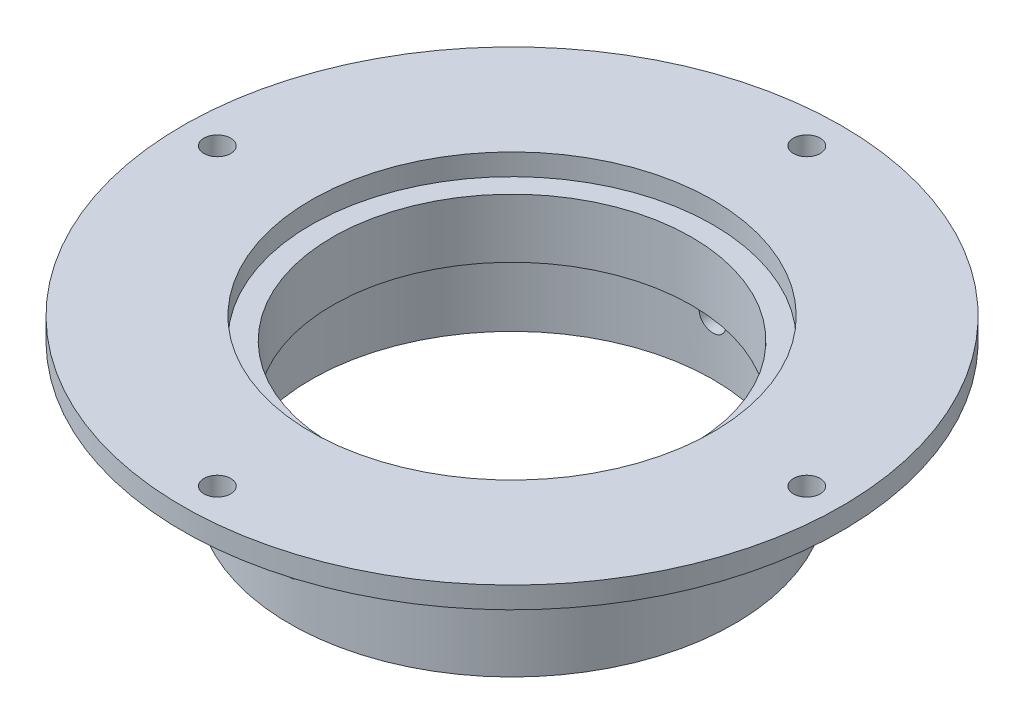
ISO-10303-21;
HEADER;
FILE_DESCRIPTION(('STEP AP214'),'2;1');
FILE_NAME('part.step','',(''),(''),'','','');
FILE_SCHEMA(('AUTOMOTIVE_DESIGN { 1 0 10303 214 1 1 1 1 }'));
ENDSEC;
DATA;
#1=APPLICATION_CONTEXT('core data for automotive mechanical design processes');
#2=APPLICATION_PROTOCOL_DEFINITION('international standard','automotive_design',2000,#1);
#3=PRODUCT_CONTEXT('',#1,'mechanical');
#4=PRODUCT('Part','Part','',(#3));
#5=PRODUCT_RELATED_PRODUCT_CATEGORY('part','',(#4));
#6=PRODUCT_DEFINITION_FORMATION('','',#4);
#7=PRODUCT_DEFINITION_CONTEXT('part definition',#1,'design');
#8=PRODUCT_DEFINITION('design','',#6,#7);
#9=PRODUCT_DEFINITION_SHAPE('','',#8);
#10=(LENGTH_UNIT() NAMED_UNIT(*) SI_UNIT(.MILLI.,.METRE.));
#11=(NAMED_UNIT(*) PLANE_ANGLE_UNIT() SI_UNIT($,.RADIAN.));
#12=(NAMED_UNIT(*) SI_UNIT($,.STERADIAN.) SOLID_ANGLE_UNIT());
#13=UNCERTAINTY_MEASURE_WITH_UNIT(LENGTH_MEASURE(1.E-05),#10,'distance_accuracy_value','');
#14=(GEOMETRIC_REPRESENTATION_CONTEXT(3) GLOBAL_UNCERTAINTY_ASSIGNED_CONTEXT((#13)) GLOBAL_UNIT_ASSIGNED_CONTEXT((#10,
#11,#12)) REPRESENTATION_CONTEXT('',''));
#15=CARTESIAN_POINT('',(0.,0.,0.));
#16=DIRECTION('',(0.,0.,1.));
#17=DIRECTION('',(1.,0.,0.));
#18=AXIS2_PLACEMENT_3D('',#15,#16,#17);
#19=CARTESIAN_POINT('',(0.,-100.5,0.));
#20=DIRECTION('',(0.,-1.,0.));
#21=DIRECTION('',(0.,0.,-1.));
#22=AXIS2_PLACEMENT_3D('',#19,#20,#21);
#23=CYLINDRICAL_SURFACE('',#22,37.5);
#24=CARTESIAN_POINT('',(0.,0.,0.));
#25=DIRECTION('',(0.,-1.,0.));
#26=DIRECTION('',(0.,0.,-1.));
#27=AXIS2_PLACEMENT_3D('',#24,#25,#26);
#28=CIRCLE('',#27,37.5);
#29=CARTESIAN_POINT('',(0.,0.,-37.5));
#30=VERTEX_POINT('',#29);
#31=EDGE_CURVE('E150',#30,#30,#28,.T.);
#32=ORIENTED_EDGE('',*,*,#31,.F.);
#33=EDGE_LOOP('',(#32));
#34=FACE_BOUND('',#33,.T.);
#35=CARTESIAN_POINT('',(0.,-4.,0.));
#36=DIRECTION('',(0.,-1.,0.));
#37=DIRECTION('',(0.,0.,-1.));
#38=AXIS2_PLACEMENT_3D('',#35,#36,#37);
#39=CIRCLE('',#38,37.5);
#40=CARTESIAN_POINT('',(0.,-4.,-37.5));
#41=VERTEX_POINT('',#40);
#42=EDGE_CURVE('E10',#41,#41,#39,.T.);
#43=ORIENTED_EDGE('',*,*,#42,.T.);
#44=EDGE_LOOP('',(#43));
#45=FACE_BOUND('',#44,.T.);
#46=ADVANCED_FACE('F41',(#34,#45),#23,.F.);
#47=CARTESIAN_POINT('',(-33.5,-4.,0.));
#48=DIRECTION('',(0.,-1.,0.));
#49=DIRECTION('',(0.,0.,-1.));
#50=AXIS2_PLACEMENT_3D('',#47,#48,#49);
#51=PLANE('',#50);
#52=ORIENTED_EDGE('',*,*,#42,.F.);
#53=EDGE_LOOP('',(#52));
#54=FACE_BOUND('',#53,.T.);
#55=CARTESIAN_POINT('',(0.,-4.,0.));
#56=DIRECTION('',(0.,-1.,0.));
#57=DIRECTION('',(0.,0.,-1.));
#58=AXIS2_PLACEMENT_3D('',#55,#56,#57);
#59=CIRCLE('',#58,33.5);
#60=CARTESIAN_POINT('',(0.,-4.,-33.5));
#61=VERTEX_POINT('',#60);
#62=EDGE_CURVE('E54',#61,#61,#59,.T.);
#63=ORIENTED_EDGE('',*,*,#62,.T.);
#64=EDGE_LOOP('',(#63));
#65=FACE_BOUND('',#64,.T.);
#66=ADVANCED_FACE('F111',(#54,#65),#51,.F.);
#67=CARTESIAN_POINT('',(0.,-100.5,0.));
#68=DIRECTION('',(0.,-1.,0.));
#69=DIRECTION('',(0.,0.,-1.));
#70=AXIS2_PLACEMENT_3D('',#67,#68,#69);
#71=CYLINDRICAL_SURFACE('',#70,33.5);
#72=ORIENTED_EDGE('',*,*,#62,.F.);
#73=EDGE_LOOP('',(#72));
#74=FACE_BOUND('',#73,.T.);
#75=CARTESIAN_POINT('',(0.,-15.,0.));
#76=DIRECTION('',(0.,-1.,0.));
#77=DIRECTION('',(0.,0.,-1.));
#78=AXIS2_PLACEMENT_3D('',#75,#76,#77);
#79=CIRCLE('',#78,33.5);
#80=CARTESIAN_POINT('',(0.,-15.,-33.5));
#81=VERTEX_POINT('',#80);
#82=EDGE_CURVE('E60',#81,#81,#79,.T.);
#83=ORIENTED_EDGE('',*,*,#82,.T.);
#84=EDGE_LOOP('',(#83));
#85=FACE_BOUND('',#84,.T.);
#86=ADVANCED_FACE('F108',(#74,#85),#71,.F.);
#87=CARTESIAN_POINT('',(-33.5,-15.,0.));
#88=DIRECTION('',(0.,1.,0.));
#89=DIRECTION('',(0.,0.,1.));
#90=AXIS2_PLACEMENT_3D('',#87,#88,#89);
#91=PLANE('',#90);
#92=ORIENTED_EDGE('',*,*,#82,.F.);
#93=EDGE_LOOP('',(#92));
#94=FACE_BOUND('',#93,.T.);
#95=CARTESIAN_POINT('',(0.,-15.,0.));
#96=DIRECTION('',(0.,-1.,0.));
#97=DIRECTION('',(0.,0.,-1.));
#98=AXIS2_PLACEMENT_3D('',#95,#96,#97);
#99=CIRCLE('',#98,37.5);
#100=CARTESIAN_POINT('',(0.,-15.,-37.5));
#101=VERTEX_POINT('',#100);
#102=EDGE_CURVE('E125',#101,#101,#99,.T.);
#103=ORIENTED_EDGE('',*,*,#102,.T.);
#104=EDGE_LOOP('',(#103));
#105=FACE_BOUND('',#104,.T.);
#106=ADVANCED_FACE('F103',(#94,#105),#91,.F.);
#107=CARTESIAN_POINT('',(0.,-100.5,0.));
#108=DIRECTION('',(0.,-1.,0.));
#109=DIRECTION('',(0.,0.,-1.));
#110=AXIS2_PLACEMENT_3D('',#107,#108,#109);
#111=CYLINDRICAL_SURFACE('',#110,37.5);
#112=CARTESIAN_POINT('',(0.,-16.5,-37.5));
#113=CARTESIAN_POINT('',(0.140258977010313,-16.5000061638706,-37.4999988949615));
#114=CARTESIAN_POINT('',(0.280615680119362,-16.5118432190733,-37.4992046860129));
#115=CARTESIAN_POINT('',(0.55745213365232,-16.5588928993364,-37.496112784275));
#116=CARTESIAN_POINT('',(0.693927201705201,-16.5941326032507,-37.493813349856));
#117=CARTESIAN_POINT('',(0.958950418399242,-16.6869696878027,-37.487971075263));
#118=CARTESIAN_POINT('',(1.08750276008044,-16.7445551223229,-37.4844288995603));
#119=CARTESIAN_POINT('',(1.33308366320748,-16.880429292928,-37.4764993321387));
#120=CARTESIAN_POINT('',(1.45011482462133,-16.9587133432211,-37.4721121317789));
#121=CARTESIAN_POINT('',(1.66956149864711,-17.1339065014567,-37.4629772438181));
#122=CARTESIAN_POINT('',(1.77195501669647,-17.2308431346089,-37.4582290298195));
#123=CARTESIAN_POINT('',(1.9590315859438,-17.4405326794866,-37.4489117445818));
#124=CARTESIAN_POINT('',(2.04371389056526,-17.5532862576056,-37.4443426809009));
#125=CARTESIAN_POINT('',(2.19303365081675,-17.7915357283236,-37.4358948341803));
#126=CARTESIAN_POINT('',(2.25765257331595,-17.9170432609483,-37.4320166907645));
#127=CARTESIAN_POINT('',(2.364892743479,-18.177156436242,-37.4253949317149));
#128=CARTESIAN_POINT('',(2.4075142544868,-18.3117619699715,-37.4226513024991));
#129=CARTESIAN_POINT('',(2.46948799848222,-18.5860361115245,-37.4186130440881));
#130=CARTESIAN_POINT('',(2.4888750410689,-18.7256968215009,-37.4173162474677));
#131=CARTESIAN_POINT('',(2.50393699377009,-19.0062957443154,-37.4163114076107));
#132=CARTESIAN_POINT('',(2.49961220364397,-19.1472339409813,-37.4166033442898));
#133=CARTESIAN_POINT('',(2.46740211693187,-19.4261496900382,-37.4187410376214));
#134=CARTESIAN_POINT('',(2.43955451686147,-19.5641316174483,-37.4205843081641));
#135=CARTESIAN_POINT('',(2.36114778897838,-19.8334582260712,-37.4256130394562));
#136=CARTESIAN_POINT('',(2.31058850980523,-19.9648028630437,-37.4287985091506));
#137=CARTESIAN_POINT('',(2.18815092527691,-20.217247436151,-37.4361555312242));
#138=CARTESIAN_POINT('',(2.11625555293596,-20.3383390707436,-37.4403278724689));
#139=CARTESIAN_POINT('',(1.95319898230805,-20.5667495312781,-37.4491876808018));
#140=CARTESIAN_POINT('',(1.86203753661863,-20.6740681803277,-37.4538751545047));
#141=CARTESIAN_POINT('',(1.66282440208197,-20.8721055868189,-37.4632480434526));
#142=CARTESIAN_POINT('',(1.55474009549578,-20.9627915371549,-37.4679334368246));
#143=CARTESIAN_POINT('',(1.32486360414213,-21.1247361426329,-37.4767653919949));
#144=CARTESIAN_POINT('',(1.20307141394195,-21.1959947900754,-37.4809119535796));
#145=CARTESIAN_POINT('',(0.949216236834571,-21.3170593718357,-37.4881994048067));
#146=CARTESIAN_POINT('',(0.817152637726992,-21.366864026286,-37.4913402344478));
#147=CARTESIAN_POINT('',(0.546512490200751,-21.443584748921,-37.4962615235866));
#148=CARTESIAN_POINT('',(0.407936028329261,-21.4705011211695,-37.4980420011561));
#149=CARTESIAN_POINT('',(0.128488427811503,-21.5006404856415,-37.5000396335898));
#150=CARTESIAN_POINT('',(-0.0123777991171103,-21.5039088289518,-37.5002597807663));
#151=CARTESIAN_POINT('',(-0.292656429188999,-21.4867779093202,-37.4991199107994));
#152=CARTESIAN_POINT('',(-0.432068840951225,-21.4663787867714,-37.4977599030293));
#153=CARTESIAN_POINT('',(-0.705354401323427,-21.402529549113,-37.4936147234098));
#154=CARTESIAN_POINT('',(-0.839232441272394,-21.359100279056,-37.4908308404194));
#155=CARTESIAN_POINT('',(-1.09780002003548,-21.2504447357855,-37.4841510218562));
#156=CARTESIAN_POINT('',(-1.22248946493214,-21.1852182398184,-37.4802550749189));
#157=CARTESIAN_POINT('',(-1.45934782845821,-21.0347046003478,-37.4717812471731));
#158=CARTESIAN_POINT('',(-1.57149749003375,-20.9493872111829,-37.4672023420591));
#159=CARTESIAN_POINT('',(-1.77989881911622,-20.7611575977401,-37.4578811933762));
#160=CARTESIAN_POINT('',(-1.87615030905113,-20.6582451769635,-37.4531389479835));
#161=CARTESIAN_POINT('',(-2.05017703871124,-20.4375509413498,-37.4440168968829));
#162=CARTESIAN_POINT('',(-2.12792282589155,-20.3197458744569,-37.4396376760658));
#163=CARTESIAN_POINT('',(-2.26252968526845,-20.0727270610753,-37.431744886098));
#164=CARTESIAN_POINT('',(-2.31939090059304,-19.9435133927808,-37.4282313110149));
#165=CARTESIAN_POINT('',(-2.41056367931974,-19.6774522717519,-37.4224702865581));
#166=CARTESIAN_POINT('',(-2.4448936897871,-19.5406111637119,-37.4202218016279));
#167=CARTESIAN_POINT('',(-2.49008977050006,-19.2630916711125,-37.4172416660747));
#168=CARTESIAN_POINT('',(-2.50095611195101,-19.1224133309249,-37.4165099979196));
#169=CARTESIAN_POINT('',(-2.49891370883697,-18.8415055259096,-37.4166464354321));
#170=CARTESIAN_POINT('',(-2.48605126159773,-18.7012757206089,-37.4175114258553));
#171=CARTESIAN_POINT('',(-2.43701248565452,-18.4249718313309,-37.4207371063492));
#172=CARTESIAN_POINT('',(-2.40083611570052,-18.288897754707,-37.4230977990663));
#173=CARTESIAN_POINT('',(-2.3062070944571,-18.0247617643401,-37.4290480901341));
#174=CARTESIAN_POINT('',(-2.24775476167295,-17.89669973607,-37.4326376709138));
#175=CARTESIAN_POINT('',(-2.11023911843818,-17.6522006452037,-37.4406412032888));
#176=CARTESIAN_POINT('',(-2.03117630435072,-17.5357633027431,-37.4450551350305));
#177=CARTESIAN_POINT('',(-1.85451193735908,-17.3175834025011,-37.454220073972));
#178=CARTESIAN_POINT('',(-1.7568766864575,-17.2158681566702,-37.4589716838866));
#179=CARTESIAN_POINT('',(-1.54588856638677,-17.030234976832,-37.4682713033829));
#180=CARTESIAN_POINT('',(-1.43253186528326,-16.9463213944406,-37.4728192629684));
#181=CARTESIAN_POINT('',(-1.19317399709723,-16.7986029561354,-37.4812044363904));
#182=CARTESIAN_POINT('',(-1.06715601992628,-16.7348253120154,-37.4850406855575));
#183=CARTESIAN_POINT('',(-0.806265538548387,-16.6294124269209,-37.4915576090638));
#184=CARTESIAN_POINT('',(-0.671403578458622,-16.5877513382411,-37.4942396316548));
#185=CARTESIAN_POINT('',(-0.446434684430285,-16.5385437760295,-37.4974455944423));
#186=CARTESIAN_POINT('',(-0.357780710404946,-16.5241086417062,-37.4983992211416));
#187=CARTESIAN_POINT('',(-0.179431157049143,-16.5048347895685,-37.4996767769118));
#188=CARTESIAN_POINT('',(-0.0897355793801816,-16.4999960564485,-37.5000007069869));
#189=CARTESIAN_POINT('',(0.,-16.5,-37.5));
#190=B_SPLINE_CURVE_WITH_KNOTS('',3,(#112,#113,#114,#115,#116,#117,#118,#119,#120,#121,#122,
#123,#124,#125,#126,#127,#128,#129,#130,#131,#132,#133,#134,#135,#136,#137,#138,#139,#140,#141,
#142,#143,#144,#145,#146,#147,#148,#149,#150,#151,#152,#153,#154,#155,#156,#157,#158,#159,#160,
#161,#162,#163,#164,#165,#166,#167,#168,#169,#170,#171,#172,#173,#174,#175,#176,#177,#178,#179,
#180,#181,#182,#183,#184,#185,#186,#187,#188,#189),.UNSPECIFIED.,.T.,.F.,(4,2,2,2,2,2,2,2,2,2,2,
2,2,2,2,2,2,2,2,2,2,2,2,2,2,2,2,2,2,2,2,2,2,2,2,2,2,2,4),(0.,0.42044933511073,0.841386015461156,
1.26209797070812,1.68271476580991,2.10395708321809,2.52521715357485,2.94686520432914,
3.36850820716953,3.78951871670979,4.21052390394733,4.63085568587033,5.05119026910787,
5.47186199327271,5.8925391197606,6.31403728936436,6.73553562601739,7.15705910425353,
7.57857698259353,7.99928627882409,8.41999307945793,8.8403197381746,9.26065069249293,
9.68161852205998,10.1025910532404,10.5242291645611,10.9458643862202,11.3671539686836,
11.7884386816358,12.2089022936415,12.6293666495884,13.0498249938944,13.4702732132185,
13.8914917024446,14.3128130401705,14.7347013400904,15.1560954859289,15.4250930621672,
15.6940902093758),.UNSPECIFIED.);
#191=CARTESIAN_POINT('',(0.,-16.5,-37.5));
#192=VERTEX_POINT('',#191);
#193=EDGE_CURVE('E93',#192,#192,#190,.T.);
#194=ORIENTED_EDGE('',*,*,#193,.T.);
#195=EDGE_LOOP('',(#194));
#196=FACE_BOUND('',#195,.T.);
#197=CARTESIAN_POINT('',(2.5,-19.,37.4165738677394));
#198=CARTESIAN_POINT('',(2.4999938357758,-18.8597414135516,37.4165749819635));
#199=CARTESIAN_POINT('',(2.48815684426542,-18.7193850997,37.4173710038323));
#200=CARTESIAN_POINT('',(2.44110744000692,-18.4425494549797,37.4204693829354));
#201=CARTESIAN_POINT('',(2.40586794707501,-18.3060748067868,37.422773485199));
#202=CARTESIAN_POINT('',(2.31303147978173,-18.0410524776753,37.4286258885745));
#203=CARTESIAN_POINT('',(2.2554464615947,-17.9125006001604,37.4321735242247));
#204=CARTESIAN_POINT('',(2.11957327125646,-17.6669204739284,37.4401124189054));
#205=CARTESIAN_POINT('',(2.04128978386669,-17.5498896258291,37.4445034869772));
#206=CARTESIAN_POINT('',(1.86609719280937,-17.330442594576,37.4536428650077));
#207=CARTESIAN_POINT('',(1.76916043831424,-17.2280485060444,37.4583916988638));
#208=CARTESIAN_POINT('',(1.55947041168601,-17.0409708367429,37.4677066693333));
#209=CARTESIAN_POINT('',(1.44671647471072,-16.9562880008014,37.4722727982567));
#210=CARTESIAN_POINT('',(1.20846669298847,-16.8069676876304,37.4807124813046));
#211=CARTESIAN_POINT('',(1.08295926989652,-16.7423486452016,37.4845853971231));
#212=CARTESIAN_POINT('',(0.822846332759722,-16.6351082230475,37.4911967262345));
#213=CARTESIAN_POINT('',(0.68824092705626,-16.592486581423,37.4939351530346));
#214=CARTESIAN_POINT('',(0.413967163587406,-16.5305125605131,37.4979653255992));
#215=CARTESIAN_POINT('',(0.274306705869023,-16.5111253615635,37.4992592359493));
#216=CARTESIAN_POINT('',(-0.00629172405724549,-16.4960630087498,37.5002618823198));
#217=CARTESIAN_POINT('',(-0.147229680182536,-16.5003875567881,37.4999706382683));
#218=CARTESIAN_POINT('',(-0.426146504722186,-16.5325972631386,37.4978375949048));
#219=CARTESIAN_POINT('',(-0.564129719714646,-16.5604449685448,37.4959982604353));
#220=CARTESIAN_POINT('',(-0.833458849217944,-16.6388523545553,37.490978916902));
#221=CARTESIAN_POINT('',(-0.96480472017783,-16.6894121841637,37.4877988990426));
#222=CARTESIAN_POINT('',(-1.21725077777288,-16.8118509023629,37.4804519398532));
#223=CARTESIAN_POINT('',(-1.33834272580493,-16.8837467285145,37.4762842149644));
#224=CARTESIAN_POINT('',(-1.56675362017927,-17.0468042644867,37.4674307665501));
#225=CARTESIAN_POINT('',(-1.67407238943518,-17.1379662219786,37.462745036366));
#226=CARTESIAN_POINT('',(-1.87210920691884,-17.3371797159468,37.4533720294177));
#227=CARTESIAN_POINT('',(-1.96279455168903,-17.4452637665943,37.4486847673807));
#228=CARTESIAN_POINT('',(-2.1247380578371,-17.6751395314245,37.4398462449533));
#229=CARTESIAN_POINT('',(-2.1959962102902,-17.7969312519044,37.4356949848092));
#230=CARTESIAN_POINT('',(-2.31706043729603,-18.0507863094462,37.4283973405386));
#231=CARTESIAN_POINT('',(-2.36686507778851,-18.1828503324637,37.4252510235912));
#232=CARTESIAN_POINT('',(-2.44358564226811,-18.4534914002556,37.4203204145338));
#233=CARTESIAN_POINT('',(-2.47050187284467,-18.592068357763,37.4185361041799));
#234=CARTESIAN_POINT('',(-2.50064070414527,-18.8715161765921,37.4165341601115));
#235=CARTESIAN_POINT('',(-2.50390879022528,-19.0123821116477,37.4163135188187));
#236=CARTESIAN_POINT('',(-2.4867774603432,-19.2926600959057,37.4174559357615));
#237=CARTESIAN_POINT('',(-2.466378184758,-19.4320721537264,37.4188189846039));
#238=CARTESIAN_POINT('',(-2.40252900015775,-19.7053560155273,37.4229724346678));
#239=CARTESIAN_POINT('',(-2.35910008888139,-19.8392327467834,37.4257615355746));
#240=CARTESIAN_POINT('',(-2.25044570223647,-20.0977978672232,37.4324516919967));
#241=CARTESIAN_POINT('',(-2.18522000201231,-20.2224861616027,37.4363527589831));
#242=CARTESIAN_POINT('',(-2.0347075230353,-20.4593437601337,37.4448345421734));
#243=CARTESIAN_POINT('',(-1.94939029622594,-20.571493678559,37.4494162859921));
#244=CARTESIAN_POINT('',(-1.76116086127257,-20.7798956016643,37.4587395458152));
#245=CARTESIAN_POINT('',(-1.65824845784797,-20.8761474298756,37.4634810635926));
#246=CARTESIAN_POINT('',(-1.43755407069367,-21.0501748635979,37.4725984085878));
#247=CARTESIAN_POINT('',(-1.31974883259119,-21.1279210139952,37.4769736457239));
#248=CARTESIAN_POINT('',(-1.07272958249259,-21.2625285112087,37.4848569551913));
#249=CARTESIAN_POINT('',(-0.943515648713972,-21.3193900011953,37.4883650334672));
#250=CARTESIAN_POINT('',(-0.677454717136942,-21.4105629675808,37.4941159544895));
#251=CARTESIAN_POINT('',(-0.540614104869122,-21.4448930099167,37.4963598387168));
#252=CARTESIAN_POINT('',(-0.263095655684382,-21.4900893224532,37.4993337084585));
#253=CARTESIAN_POINT('',(-0.122417862708368,-21.5009558612284,37.5000637113017));
#254=CARTESIAN_POINT('',(0.158490302579353,-21.4989140222836,37.4999276143567));
#255=CARTESIAN_POINT('',(0.298721013518656,-21.4860517061294,37.4990646068588));
#256=CARTESIAN_POINT('',(0.575026746126475,-21.4370128732272,37.495845652794));
#257=CARTESIAN_POINT('',(0.711101760730212,-21.4008363168468,37.4934897036892));
#258=CARTESIAN_POINT('',(0.975239590446423,-21.3062065815453,37.4875495852328));
#259=CARTESIAN_POINT('',(1.10330251913251,-21.2477537184806,37.483965433296));
#260=CARTESIAN_POINT('',(1.34780318872937,-21.1102367368661,37.4759710715995));
#261=CARTESIAN_POINT('',(1.46424121005912,-21.0311731156604,37.4715608817731));
#262=CARTESIAN_POINT('',(1.68242104019189,-20.8545078737266,37.4624001559628));
#263=CARTESIAN_POINT('',(1.78413568550433,-20.7568727386817,37.4576490144988));
#264=CARTESIAN_POINT('',(1.96976770799163,-20.5458850956135,37.4483468024358));
#265=CARTESIAN_POINT('',(2.05368073199643,-20.4325287543419,37.4437957809887));
#266=CARTESIAN_POINT('',(2.20139858394095,-20.1931711663465,37.4354022654285));
#267=CARTESIAN_POINT('',(2.26517609589868,-20.0671530452856,37.4315607367236));
#268=CARTESIAN_POINT('',(2.37058869377492,-19.8062622561618,37.4250333944243));
#269=CARTESIAN_POINT('',(2.41224962938885,-19.6714001330563,37.4223462323188));
#270=CARTESIAN_POINT('',(2.46145675077263,-19.4464316501172,37.4191338001879));
#271=CARTESIAN_POINT('',(2.4758916869137,-19.3577782813699,37.418178136945));
#272=CARTESIAN_POINT('',(2.49516527569733,-19.1794299412743,37.4168978147973));
#273=CARTESIAN_POINT('',(2.50000394376201,-19.0897349716002,37.4165731548784));
#274=CARTESIAN_POINT('',(2.5,-19.,37.4165738677394));
#275=B_SPLINE_CURVE_WITH_KNOTS('',3,(#197,#198,#199,#200,#201,#202,#203,#204,#205,#206,#207,
#208,#209,#210,#211,#212,#213,#214,#215,#216,#217,#218,#219,#220,#221,#222,#223,#224,#225,#226,
#227,#228,#229,#230,#231,#232,#233,#234,#235,#236,#237,#238,#239,#240,#241,#242,#243,#244,#245,
#246,#247,#248,#249,#250,#251,#252,#253,#254,#255,#256,#257,#258,#259,#260,#261,#262,#263,#264,
#265,#266,#267,#268,#269,#270,#271,#272,#273,#274),.UNSPECIFIED.,.T.,.F.,(4,2,2,2,2,2,2,2,2,2,2,
2,2,2,2,2,2,2,2,2,2,2,2,2,2,2,2,2,2,2,2,2,2,2,2,2,2,2,4),(0.,0.420448162102348,
0.841383695133602,1.26209431268694,1.68270979063285,2.10395364268127,2.52521520614237,
2.94686269104472,3.36850515573164,3.78951494410043,4.21051943966294,4.63085488448754,
5.05119308698644,5.47186587127798,5.89254406375853,6.31404069941778,6.735537528711,
7.1570625285942,7.57858188207614,7.99929026001855,8.41999614264995,8.84031909601612,
9.26064638556669,9.68161481395295,10.1025879147731,10.5242266551725,10.9458625050601,
11.3671504888988,11.7884336504446,12.2088998932109,12.6293668507397,13.0498278466776,
13.4702786976964,13.8914956227879,14.3128154329274,14.7347043767421,15.1560991280649,
15.4250948842256,15.6940902080842),.UNSPECIFIED.);
#276=CARTESIAN_POINT('',(2.5,-19.,37.4165738677394));
#277=VERTEX_POINT('',#276);
#278=EDGE_CURVE('E86',#277,#277,#275,.T.);
#279=ORIENTED_EDGE('',*,*,#278,.T.);
#280=EDGE_LOOP('',(#279));
#281=FACE_BOUND('',#280,.T.);
#282=ORIENTED_EDGE('',*,*,#102,.F.);
#283=EDGE_LOOP('',(#282));
#284=FACE_BOUND('',#283,.T.);
#285=CARTESIAN_POINT('',(0.,-29.,0.));
#286=DIRECTION('',(0.,-1.,0.));
#287=DIRECTION('',(0.,0.,-1.));
#288=AXIS2_PLACEMENT_3D('',#285,#286,#287);
#289=CIRCLE('',#288,37.5);
#290=CARTESIAN_POINT('',(0.,-29.,-37.5));
#291=VERTEX_POINT('',#290);
#292=EDGE_CURVE('E128',#291,#291,#289,.T.);
#293=ORIENTED_EDGE('',*,*,#292,.T.);
#294=EDGE_LOOP('',(#293));
#295=FACE_BOUND('',#294,.T.);
#296=ADVANCED_FACE('F98',(#196,#281,#284,#295),#111,.F.);
#297=CARTESIAN_POINT('',(-37.5,-29.,0.));
#298=DIRECTION('',(0.,1.,0.));
#299=DIRECTION('',(0.,0.,1.));
#300=AXIS2_PLACEMENT_3D('',#297,#298,#299);
#301=PLANE('',#300);
#302=ORIENTED_EDGE('',*,*,#292,.F.);
#303=EDGE_LOOP('',(#302));
#304=FACE_BOUND('',#303,.T.);
#305=CARTESIAN_POINT('',(0.,-29.,0.));
#306=DIRECTION('',(0.,-1.,0.));
#307=DIRECTION('',(0.,0.,-1.));
#308=AXIS2_PLACEMENT_3D('',#305,#306,#307);
#309=CIRCLE('',#308,41.5);
#310=CARTESIAN_POINT('',(0.,-29.,-41.5));
#311=VERTEX_POINT('',#310);
#312=EDGE_CURVE('E134',#311,#311,#309,.T.);
#313=ORIENTED_EDGE('',*,*,#312,.T.);
#314=EDGE_LOOP('',(#313));
#315=FACE_BOUND('',#314,.T.);
#316=ADVANCED_FACE('F102',(#304,#315),#301,.F.);
#317=CARTESIAN_POINT('',(0.,-100.5,0.));
#318=DIRECTION('',(0.,-1.,0.));
#319=DIRECTION('',(0.,0.,-1.));
#320=AXIS2_PLACEMENT_3D('',#317,#318,#319);
#321=CYLINDRICAL_SURFACE('',#320,41.5);
#322=CARTESIAN_POINT('',(0.,-16.5,-41.5));
#323=CARTESIAN_POINT('',(-0.140289597190989,-16.5000061765291,-41.4999989976894));
#324=CARTESIAN_POINT('',(-0.280677672652578,-16.5118483794204,-41.4992810225125));
#325=CARTESIAN_POINT('',(-0.557578104859904,-16.5589196999643,-41.4964859019679));
#326=CARTESIAN_POINT('',(-0.694085745665149,-16.5941761039312,-41.4944071708503));
#327=CARTESIAN_POINT('',(-0.959174262578943,-16.687060142773,-41.4891257218095));
#328=CARTESIAN_POINT('',(-1.08775925134986,-16.7446760554624,-41.4859235929226));
#329=CARTESIAN_POINT('',(-1.33339901873117,-16.8806247970928,-41.4787555941964));
#330=CARTESIAN_POINT('',(-1.45045644543907,-16.9589528527582,-41.4747899003839));
#331=CARTESIAN_POINT('',(-1.66991619231508,-17.1342230369453,-41.4665343877736));
#332=CARTESIAN_POINT('',(-1.77230024458894,-17.231188022421,-41.4622441749342));
#333=CARTESIAN_POINT('',(-1.95935079944999,-17.4409327000825,-41.4538265261724));
#334=CARTESIAN_POINT('',(-2.04401656500179,-17.5537130498213,-41.4496990970273));
#335=CARTESIAN_POINT('',(-2.19328260298155,-17.7919893460307,-41.442069467748));
#336=CARTESIAN_POINT('',(-2.25786783514451,-17.9174947306658,-41.4385677370912));
#337=CARTESIAN_POINT('',(-2.36504319339573,-18.1775922471178,-41.4325894507098));
#338=CARTESIAN_POINT('',(-2.40763354226449,-18.3121842868827,-41.4301128846016));
#339=CARTESIAN_POINT('',(-2.4695598088007,-18.5864597097798,-41.4264679342597));
#340=CARTESIAN_POINT('',(-2.48892415585095,-18.7261366524946,-41.4252979508474));
#341=CARTESIAN_POINT('',(-2.50393648882093,-19.0067630238548,-41.4243933136132));
#342=CARTESIAN_POINT('',(-2.49958472727226,-19.1477124389347,-41.4246586445078));
#343=CARTESIAN_POINT('',(-2.46731198080679,-19.4266890965429,-41.4265932296025));
#344=CARTESIAN_POINT('',(-2.43942175067797,-19.5647199113329,-41.4282606518538));
#345=CARTESIAN_POINT('',(-2.36091146305781,-19.8341371353694,-41.4328086211479));
#346=CARTESIAN_POINT('',(-2.31029127726877,-19.9655235071072,-41.4356891750383));
#347=CARTESIAN_POINT('',(-2.1877230443096,-20.2180211275545,-41.4423408880595));
#348=CARTESIAN_POINT('',(-2.11576103205047,-20.3391255813091,-41.4461126300125));
#349=CARTESIAN_POINT('',(-1.9525620135385,-20.5675473615483,-41.4541210705933));
#350=CARTESIAN_POINT('',(-1.86132480648243,-20.6748645443825,-41.4583577740648));
#351=CARTESIAN_POINT('',(-1.66199200519676,-20.8728443914874,-41.4668268117636));
#352=CARTESIAN_POINT('',(-1.55386979140009,-20.963480257204,-41.4710591282842));
#353=CARTESIAN_POINT('',(-1.32392953502835,-21.1253179814975,-41.4790359352317));
#354=CARTESIAN_POINT('',(-1.20211148797772,-21.1965198337237,-41.4827804254992));
#355=CARTESIAN_POINT('',(-0.948221392708441,-21.3174660437748,-41.4893598897929));
#356=CARTESIAN_POINT('',(-0.816148867308278,-21.367209402344,-41.4921948214623));
#357=CARTESIAN_POINT('',(-0.54550606981204,-21.4438087676723,-41.4966351247106));
#358=CARTESIAN_POINT('',(-0.406935868244343,-21.4706650227965,-41.4982405096323));
#359=CARTESIAN_POINT('',(-0.127463757985998,-21.5006946591837,-41.5000390936335));
#360=CARTESIAN_POINT('',(0.0134341555524288,-21.5039050950311,-41.5002345022307));
#361=CARTESIAN_POINT('',(0.293766543983136,-21.4866487550146,-41.4991969881734));
#362=CARTESIAN_POINT('',(0.433201025939618,-21.4661820934967,-41.4979640724168));
#363=CARTESIAN_POINT('',(0.706544240575498,-21.4021832109577,-41.4942101413078));
#364=CARTESIAN_POINT('',(0.840456964038636,-21.3586679745115,-41.4916900745103));
#365=CARTESIAN_POINT('',(1.09907849857083,-21.2498244242332,-41.4856453984607));
#366=CARTESIAN_POINT('',(1.22378723268497,-21.1844959280448,-41.4821207808106));
#367=CARTESIAN_POINT('',(1.46063054056789,-21.033785860661,-41.4744576279753));
#368=CARTESIAN_POINT('',(1.5727493303245,-20.9483795236366,-41.4703183369376));
#369=CARTESIAN_POINT('',(1.78107125176641,-20.7599742220502,-41.4618942677928));
#370=CARTESIAN_POINT('',(1.87727423754094,-20.6569750962209,-41.4576094883523));
#371=CARTESIAN_POINT('',(2.05115907035175,-20.4361482083535,-41.4493709886718));
#372=CARTESIAN_POINT('',(2.12881689081169,-20.3183015087814,-41.4454177021584));
#373=CARTESIAN_POINT('',(2.26324265055412,-20.0712199883182,-41.4382948896881));
#374=CARTESIAN_POINT('',(2.32001071123082,-19.9419852336107,-41.4351253591766));
#375=CARTESIAN_POINT('',(2.4110038520176,-19.6758841095477,-41.4299306124648));
#376=CARTESIAN_POINT('',(2.44524409275229,-19.5390229399836,-41.4279046268199));
#377=CARTESIAN_POINT('',(2.49025916655928,-19.261481636726,-41.4252233021235));
#378=CARTESIAN_POINT('',(2.50103421281743,-19.1208015377399,-41.4245679506194));
#379=CARTESIAN_POINT('',(2.49881099665102,-18.8398547153571,-41.4247020997791));
#380=CARTESIAN_POINT('',(2.4858505117103,-18.6995876903539,-41.4254893044709));
#381=CARTESIAN_POINT('',(2.43660241197632,-18.4232252064067,-41.4284149924373));
#382=CARTESIAN_POINT('',(2.40031475443973,-18.2871297551068,-41.4305534781879));
#383=CARTESIAN_POINT('',(2.30545075014494,-18.0229675802825,-41.4359401788745));
#384=CARTESIAN_POINT('',(2.24687448923918,-17.8949008258348,-41.439188389536));
#385=CARTESIAN_POINT('',(2.10910143819969,-17.6504151375557,-41.4464284191309));
#386=CARTESIAN_POINT('',(2.02990520156803,-17.5339958911862,-41.4504202181034));
#387=CARTESIAN_POINT('',(1.85300124077304,-17.3159187757426,-41.4587049582726));
#388=CARTESIAN_POINT('',(1.75526634559245,-17.2142829651114,-41.462998335585));
#389=CARTESIAN_POINT('',(1.54409326652406,-17.0288265454526,-41.4713987873133));
#390=CARTESIAN_POINT('',(1.43065124233074,-16.9450103059565,-41.475505815841));
#391=CARTESIAN_POINT('',(1.19116291534013,-16.7975150235263,-41.4830747561524));
#392=CARTESIAN_POINT('',(1.06510187637589,-16.7338598939295,-41.4865358998609));
#393=CARTESIAN_POINT('',(0.80415286338156,-16.6286961123054,-41.492412556284));
#394=CARTESIAN_POINT('',(0.669275454418356,-16.5871614793371,-41.4948292950397));
#395=CARTESIAN_POINT('',(0.444641940559208,-16.5382324878816,-41.497710349472));
#396=CARTESIAN_POINT('',(0.356338451606036,-16.5239137976737,-41.4985651609125));
#397=CARTESIAN_POINT('',(0.178703296171218,-16.5047955924207,-41.4997103050781));
#398=CARTESIAN_POINT('',(0.0893716310009536,-16.4999960652359,-41.5000006385229));
#399=CARTESIAN_POINT('',(0.,-16.5,-41.5));
#400=B_SPLINE_CURVE_WITH_KNOTS('',3,(#322,#323,#324,#325,#326,#327,#328,#329,#330,#331,#332,
#333,#334,#335,#336,#337,#338,#339,#340,#341,#342,#343,#344,#345,#346,#347,#348,#349,#350,#351,
#352,#353,#354,#355,#356,#357,#358,#359,#360,#361,#362,#363,#364,#365,#366,#367,#368,#369,#370,
#371,#372,#373,#374,#375,#376,#377,#378,#379,#380,#381,#382,#383,#384,#385,#386,#387,#388,#389,
#390,#391,#392,#393,#394,#395,#396,#397,#398,#399),.UNSPECIFIED.,.T.,.F.,(4,2,2,2,2,2,2,2,2,2,2,
2,2,2,2,2,2,2,2,2,2,2,2,2,2,2,2,2,2,2,2,2,2,2,2,2,2,2,4),(0.,0.420542535966959,
0.841576023534876,1.2623890778256,1.68310523684483,2.10434070720628,2.5255936964043,
2.94716144706601,3.36872492769313,3.78977187256607,4.21081433409598,4.63130752197573,
5.05180308333066,5.4725744066224,5.89335011360067,6.31479600667332,6.73624203746728,
7.15770769158282,7.5791687720001,7.99996925384207,8.42076770348242,8.84125649581449,
9.26174880347153,9.68276253142034,10.1037801188682,10.5253402406349,10.9468979126003,
11.3681715964729,11.7894414529763,12.2100413987784,12.6306421152652,13.0512412116756,
13.4718290191071,13.8930380880948,14.3143503228027,14.7361604256978,15.1574740059373,
15.425381399137,15.6932884506732),.UNSPECIFIED.);
#401=CARTESIAN_POINT('',(0.,-16.5,-41.5));
#402=VERTEX_POINT('',#401);
#403=EDGE_CURVE('E44',#402,#402,#400,.T.);
#404=ORIENTED_EDGE('',*,*,#403,.T.);
#405=EDGE_LOOP('',(#404));
#406=FACE_BOUND('',#405,.T.);
#407=CARTESIAN_POINT('',(2.5,-19.,41.4246303544159));
#408=CARTESIAN_POINT('',(2.49999382323479,-19.1402893367397,41.4246313635329));
#409=CARTESIAN_POINT('',(2.48815166282645,-19.2806771526273,41.4253506767567));
#410=CARTESIAN_POINT('',(2.44108052638004,-19.5575770454801,41.4281505779497));
#411=CARTESIAN_POINT('',(2.40582426314265,-19.6940844063015,41.4302327541822));
#412=CARTESIAN_POINT('',(2.31294063603266,-19.9591723313524,41.4355216793528));
#413=CARTESIAN_POINT('',(2.25532500105622,-20.0877570106158,41.438727838606));
#414=CARTESIAN_POINT('',(2.1193769132899,-20.3333962600494,41.4459027220324));
#415=CARTESIAN_POINT('',(2.04104923308744,-20.4504534779259,41.4498712704739));
#416=CARTESIAN_POINT('',(1.86577942706555,-20.6699134632608,41.4581300911271));
#417=CARTESIAN_POINT('',(1.76881436051861,-20.7722978960469,41.4624207558228));
#418=CARTESIAN_POINT('',(1.55906936130667,-20.9593491845433,41.4708366862349));
#419=CARTESIAN_POINT('',(1.44628877212273,-21.0440153043839,41.4749619450758));
#420=CARTESIAN_POINT('',(1.20801226875175,-21.1932817107777,41.4825855473617));
#421=CARTESIAN_POINT('',(1.08250695755278,-21.257867022711,41.4860834221364));
#422=CARTESIAN_POINT('',(0.822409600780256,-21.3650425487383,41.492054017252));
#423=CARTESIAN_POINT('',(0.687817646860435,-21.4076329846493,41.4945267479313));
#424=CARTESIAN_POINT('',(0.413542476091545,-21.4695594361337,41.4981657372055));
#425=CARTESIAN_POINT('',(0.273865701101676,-21.4889238876554,41.4993335932593));
#426=CARTESIAN_POINT('',(-0.00676034264836332,-21.5039364876699,41.5002366148306));
#427=CARTESIAN_POINT('',(-0.147709597902594,-21.499584887587,41.4999717955366));
#428=CARTESIAN_POINT('',(-0.426686973623017,-21.4673123945159,41.4980406420843));
#429=CARTESIAN_POINT('',(-0.564718647387815,-21.4394220938423,41.4963761270653));
#430=CARTESIAN_POINT('',(-0.834137553028213,-21.3609113665083,41.4918350919569));
#431=CARTESIAN_POINT('',(-0.965524747856024,-21.3102908131258,41.4889585651106));
#432=CARTESIAN_POINT('',(-1.21802335732612,-21.1877218236876,41.4823142809984));
#433=CARTESIAN_POINT('',(-1.33912801910989,-21.1157595090768,41.4785459441112));
#434=CARTESIAN_POINT('',(-1.56755008673654,-20.9525598477341,41.4705421907138));
#435=CARTESIAN_POINT('',(-1.67486734879704,-20.861322300016,41.4663067693334));
#436=CARTESIAN_POINT('',(-1.87284680273415,-20.6619892598506,41.4578376302244));
#437=CARTESIAN_POINT('',(-1.96348226507673,-20.5538672166771,41.4536039258914));
#438=CARTESIAN_POINT('',(-2.12531925721493,-20.3239274443969,41.4456222594641));
#439=CARTESIAN_POINT('',(-2.19652077984646,-20.2021097102414,41.4418742975489));
#440=CARTESIAN_POINT('',(-2.31746675380568,-19.9482196938396,41.4352873125592));
#441=CARTESIAN_POINT('',(-2.36721010307379,-19.816146885319,41.4324483361707));
#442=CARTESIAN_POINT('',(-2.44380936278228,-19.5455034733138,41.4280011661607));
#443=CARTESIAN_POINT('',(-2.47066552327006,-19.4069329408357,41.4263929590927));
#444=CARTESIAN_POINT('',(-2.50069480363332,-19.127460686054,41.4245912021429));
#445=CARTESIAN_POINT('',(-2.50390506791124,-18.9865629685899,41.4243954335272));
#446=CARTESIAN_POINT('',(-2.48664845476582,-18.7062310137328,41.4254348352768));
#447=CARTESIAN_POINT('',(-2.46618169167507,-18.5667967692762,41.4266699987322));
#448=CARTESIAN_POINT('',(-2.402182845885,-18.2934546884093,41.4304300395045));
#449=CARTESIAN_POINT('',(-2.35866784935345,-18.1595428372855,41.4329539613862));
#450=CARTESIAN_POINT('',(-2.24982507164943,-17.900922941033,41.4390062725923));
#451=CARTESIAN_POINT('',(-2.18449710671661,-17.7762149734521,41.4425346703787));
#452=CARTESIAN_POINT('',(-2.03378781300748,-17.5393721733081,41.4502036864342));
#453=CARTESIAN_POINT('',(-1.94838158325783,-17.4272532107845,41.4543450625346));
#454=CARTESIAN_POINT('',(-1.75997639819995,-17.2189308906658,41.4627706681541));
#455=CARTESIAN_POINT('',(-1.65697728244071,-17.1227276782416,41.4670548989757));
#456=CARTESIAN_POINT('',(-1.43615029266868,-16.9488423763528,41.4752899061008));
#457=CARTESIAN_POINT('',(-1.31830347991831,-16.8711843147931,41.4792402455669));
#458=CARTESIAN_POINT('',(-1.07122167077067,-16.7367581315963,41.4863560553165));
#459=CARTESIAN_POINT('',(-0.941986740568732,-16.6799898885435,41.4895215301617));
#460=CARTESIAN_POINT('',(-0.675885744096977,-16.5889966225036,41.4947088311023));
#461=CARTESIAN_POINT('',(-0.539024904655676,-16.5547563599838,41.4967314301894));
#462=CARTESIAN_POINT('',(-0.261484295958853,-16.5097411306723,41.4994081488338));
#463=CARTESIAN_POINT('',(-0.120804561125673,-16.4989659524447,41.500062280722));
#464=CARTESIAN_POINT('',(0.160142504395694,-16.5011887924624,41.4999283974246));
#465=CARTESIAN_POINT('',(0.300410135372223,-16.5141491906543,41.4991426643732));
#466=CARTESIAN_POINT('',(0.576773852401715,-16.5633973304804,41.4962219546972));
#467=CARTESIAN_POINT('',(0.712869931004486,-16.5996851137736,41.4940869756631));
#468=CARTESIAN_POINT('',(0.977033331827907,-16.694549596471,41.4887077890479));
#469=CARTESIAN_POINT('',(1.10510068454957,-16.7531262111942,41.4854635856812));
#470=CARTESIAN_POINT('',(1.34958742110017,-16.8909001543591,41.4782303190209));
#471=CARTESIAN_POINT('',(1.46600711783505,-16.9700969286489,41.4742412757451));
#472=CARTESIAN_POINT('',(1.68408418352177,-17.1470014709586,41.4659596215631));
#473=CARTESIAN_POINT('',(1.78571959306227,-17.2447362877376,41.4616665728929));
#474=CARTESIAN_POINT('',(1.97117524020953,-17.4559090463592,41.4532641767987));
#475=CARTESIAN_POINT('',(2.05499110724909,-17.5693508293812,41.4491548746366));
#476=CARTESIAN_POINT('',(2.20248600003921,-17.8088389698995,41.441579762788));
#477=CARTESIAN_POINT('',(2.26614104255474,-17.9349001065701,41.4381147215192));
#478=CARTESIAN_POINT('',(2.3713046340948,-18.1958493287522,41.432230382725));
#479=CARTESIAN_POINT('',(2.4128391653924,-18.3307268486358,41.4298098589694));
#480=CARTESIAN_POINT('',(2.46176786308653,-18.5553600893059,41.4269240528265));
#481=CARTESIAN_POINT('',(2.47608642126754,-18.6436631733832,41.4260677496328));
#482=CARTESIAN_POINT('',(2.49520445106883,-18.8212975171962,41.4249205793617));
#483=CARTESIAN_POINT('',(2.50000393490399,-18.9106287756124,41.4246297115587));
#484=CARTESIAN_POINT('',(2.5,-19.,41.4246303544159));
#485=B_SPLINE_CURVE_WITH_KNOTS('',3,(#407,#408,#409,#410,#411,#412,#413,#414,#415,#416,#417,
#418,#419,#420,#421,#422,#423,#424,#425,#426,#427,#428,#429,#430,#431,#432,#433,#434,#435,#436,
#437,#438,#439,#440,#441,#442,#443,#444,#445,#446,#447,#448,#449,#450,#451,#452,#453,#454,#455,
#456,#457,#458,#459,#460,#461,#462,#463,#464,#465,#466,#467,#468,#469,#470,#471,#472,#473,#474,
#475,#476,#477,#478,#479,#480,#481,#482,#483,#484),.UNSPECIFIED.,.T.,.F.,(4,2,2,2,2,2,2,2,2,2,2,
2,2,2,2,2,2,2,2,2,2,2,2,2,2,2,2,2,2,2,2,2,2,2,2,2,2,2,4),(0.,0.420541753746272,
0.841574476192638,1.26238663839076,1.68310191902327,2.1043384127146,2.52559239755393,
2.94715976978382,3.36872289044871,3.78976935599674,4.21081135785415,4.63130698930714,
5.05180496506978,5.47257699267525,5.89335340796032,6.314798280006,6.73624330741213,
7.15770997702621,7.57917204196821,7.99997190735672,8.4207697407783,8.84125606312124,
9.2617459278828,9.68276005924459,10.1037780305531,10.525338566922,10.9468966530618,
11.36816927324,11.7894380974568,12.2100398031774,12.6306422600287,13.0512431189204,
13.4718326756348,13.8930406999878,14.3143519143988,14.7361624526626,15.157476442578,
15.4253826180596,15.6932884497635),.UNSPECIFIED.);
#486=CARTESIAN_POINT('',(2.5,-19.,41.4246303544159));
#487=VERTEX_POINT('',#486);
#488=EDGE_CURVE('E63',#487,#487,#485,.T.);
#489=ORIENTED_EDGE('',*,*,#488,.T.);
#490=EDGE_LOOP('',(#489));
#491=FACE_BOUND('',#490,.T.);
#492=ORIENTED_EDGE('',*,*,#312,.F.);
#493=EDGE_LOOP('',(#492));
#494=FACE_BOUND('',#493,.T.);
#495=CARTESIAN_POINT('',(0.,-4.,0.));
#496=DIRECTION('',(0.,-1.,0.));
#497=DIRECTION('',(0.,0.,-1.));
#498=AXIS2_PLACEMENT_3D('',#495,#496,#497);
#499=CIRCLE('',#498,41.5);
#500=CARTESIAN_POINT('',(0.,-4.,-41.5));
#501=VERTEX_POINT('',#500);
#502=EDGE_CURVE('E138',#501,#501,#499,.T.);
#503=ORIENTED_EDGE('',*,*,#502,.T.);
#504=EDGE_LOOP('',(#503));
#505=FACE_BOUND('',#504,.T.);
#506=ADVANCED_FACE('F69',(#406,#491,#494,#505),#321,.T.);
#507=CARTESIAN_POINT('',(-41.5,-4.,0.));
#508=DIRECTION('',(0.,1.,0.));
#509=DIRECTION('',(0.,0.,1.));
#510=AXIS2_PLACEMENT_3D('',#507,#508,#509);
#511=PLANE('',#510);
#512=CARTESIAN_POINT('',(55.,-4.,0.));
#513=DIRECTION('',(0.,-1.,0.));
#514=DIRECTION('',(0.,0.,-1.));
#515=AXIS2_PLACEMENT_3D('',#512,#513,#514);
#516=CIRCLE('',#515,2.49999999999999);
#517=CARTESIAN_POINT('',(55.,-4.,-2.49999999999999));
#518=VERTEX_POINT('',#517);
#519=EDGE_CURVE('E179',#518,#518,#516,.T.);
#520=ORIENTED_EDGE('',*,*,#519,.F.);
#521=EDGE_LOOP('',(#520));
#522=FACE_BOUND('',#521,.T.);
#523=CARTESIAN_POINT('',(-55.,-4.,0.));
#524=DIRECTION('',(0.,-1.,0.));
#525=DIRECTION('',(0.,0.,-1.));
#526=AXIS2_PLACEMENT_3D('',#523,#524,#525);
#527=CIRCLE('',#526,2.49999999999999);
#528=CARTESIAN_POINT('',(-55.,-4.,-2.49999999999999));
#529=VERTEX_POINT('',#528);
#530=EDGE_CURVE('E175',#529,#529,#527,.T.);
#531=ORIENTED_EDGE('',*,*,#530,.F.);
#532=EDGE_LOOP('',(#531));
#533=FACE_BOUND('',#532,.T.);
#534=CARTESIAN_POINT('',(0.,-4.,55.));
#535=DIRECTION('',(0.,-1.,0.));
#536=DIRECTION('',(0.,0.,-1.));
#537=AXIS2_PLACEMENT_3D('',#534,#535,#536);
#538=CIRCLE('',#537,2.5);
#539=CARTESIAN_POINT('',(0.,-4.,52.5));
#540=VERTEX_POINT('',#539);
#541=EDGE_CURVE('E167',#540,#540,#538,.T.);
#542=ORIENTED_EDGE('',*,*,#541,.F.);
#543=EDGE_LOOP('',(#542));
#544=FACE_BOUND('',#543,.T.);
#545=CARTESIAN_POINT('',(0.,-4.,-55.));
#546=DIRECTION('',(0.,-1.,0.));
#547=DIRECTION('',(0.,0.,-1.));
#548=AXIS2_PLACEMENT_3D('',#545,#546,#547);
#549=CIRCLE('',#548,2.5);
#550=CARTESIAN_POINT('',(0.,-4.,-57.5));
#551=VERTEX_POINT('',#550);
#552=EDGE_CURVE('E159',#551,#551,#549,.T.);
#553=ORIENTED_EDGE('',*,*,#552,.F.);
#554=EDGE_LOOP('',(#553));
#555=FACE_BOUND('',#554,.T.);
#556=ORIENTED_EDGE('',*,*,#502,.F.);
#557=EDGE_LOOP('',(#556));
#558=FACE_BOUND('',#557,.T.);
#559=CARTESIAN_POINT('',(0.,-4.,0.));
#560=DIRECTION('',(0.,-1.,0.));
#561=DIRECTION('',(0.,0.,-1.));
#562=AXIS2_PLACEMENT_3D('',#559,#560,#561);
#563=CIRCLE('',#562,61.5);
#564=CARTESIAN_POINT('',(0.,-4.,-61.5));
#565=VERTEX_POINT('',#564);
#566=EDGE_CURVE('E142',#565,#565,#563,.T.);
#567=ORIENTED_EDGE('',*,*,#566,.T.);
#568=EDGE_LOOP('',(#567));
#569=FACE_BOUND('',#568,.T.);
#570=ADVANCED_FACE('F194',(#522,#533,#544,#555,#558,#569),#511,.F.);
#571=CARTESIAN_POINT('',(0.,-100.5,0.));
#572=DIRECTION('',(0.,-1.,0.));
#573=DIRECTION('',(0.,0.,-1.));
#574=AXIS2_PLACEMENT_3D('',#571,#572,#573);
#575=CYLINDRICAL_SURFACE('',#574,61.5);
#576=ORIENTED_EDGE('',*,*,#566,.F.);
#577=EDGE_LOOP('',(#576));
#578=FACE_BOUND('',#577,.T.);
#579=CARTESIAN_POINT('',(0.,0.,0.));
#580=DIRECTION('',(0.,-1.,0.));
#581=DIRECTION('',(0.,0.,-1.));
#582=AXIS2_PLACEMENT_3D('',#579,#580,#581);
#583=CIRCLE('',#582,61.5);
#584=CARTESIAN_POINT('',(0.,0.,-61.5));
#585=VERTEX_POINT('',#584);
#586=EDGE_CURVE('E146',#585,#585,#583,.T.);
#587=ORIENTED_EDGE('',*,*,#586,.T.);
#588=EDGE_LOOP('',(#587));
#589=FACE_BOUND('',#588,.T.);
#590=ADVANCED_FACE('F197',(#578,#589),#575,.T.);
#591=CARTESIAN_POINT('',(-61.5,0.,0.));
#592=DIRECTION('',(0.,-1.,0.));
#593=DIRECTION('',(0.,0.,-1.));
#594=AXIS2_PLACEMENT_3D('',#591,#592,#593);
#595=PLANE('',#594);
#596=CARTESIAN_POINT('',(55.,0.,0.));
#597=DIRECTION('',(0.,-1.,0.));
#598=DIRECTION('',(0.,0.,-1.));
#599=AXIS2_PLACEMENT_3D('',#596,#597,#598);
#600=CIRCLE('',#599,2.49999999999999);
#601=CARTESIAN_POINT('',(55.,0.,-2.49999999999999));
#602=VERTEX_POINT('',#601);
#603=EDGE_CURVE('E154',#602,#602,#600,.T.);
#604=ORIENTED_EDGE('',*,*,#603,.T.);
#605=EDGE_LOOP('',(#604));
#606=FACE_BOUND('',#605,.T.);
#607=CARTESIAN_POINT('',(-55.,0.,0.));
#608=DIRECTION('',(0.,-1.,0.));
#609=DIRECTION('',(0.,0.,-1.));
#610=AXIS2_PLACEMENT_3D('',#607,#608,#609);
#611=CIRCLE('',#610,2.49999999999999);
#612=CARTESIAN_POINT('',(-55.,0.,-2.49999999999999));
#613=VERTEX_POINT('',#612);
#614=EDGE_CURVE('E171',#613,#613,#611,.T.);
#615=ORIENTED_EDGE('',*,*,#614,.T.);
#616=EDGE_LOOP('',(#615));
#617=FACE_BOUND('',#616,.T.);
#618=CARTESIAN_POINT('',(0.,0.,55.));
#619=DIRECTION('',(0.,-1.,0.));
#620=DIRECTION('',(0.,0.,-1.));
#621=AXIS2_PLACEMENT_3D('',#618,#619,#620);
#622=CIRCLE('',#621,2.5);
#623=CARTESIAN_POINT('',(0.,0.,52.5));
#624=VERTEX_POINT('',#623);
#625=EDGE_CURVE('E163',#624,#624,#622,.T.);
#626=ORIENTED_EDGE('',*,*,#625,.T.);
#627=EDGE_LOOP('',(#626));
#628=FACE_BOUND('',#627,.T.);
#629=CARTESIAN_POINT('',(0.,0.,-55.));
#630=DIRECTION('',(0.,-1.,0.));
#631=DIRECTION('',(0.,0.,-1.));
#632=AXIS2_PLACEMENT_3D('',#629,#630,#631);
#633=CIRCLE('',#632,2.5);
#634=CARTESIAN_POINT('',(0.,0.,-57.5));
#635=VERTEX_POINT('',#634);
#636=EDGE_CURVE('E155',#635,#635,#633,.T.);
#637=ORIENTED_EDGE('',*,*,#636,.T.);
#638=EDGE_LOOP('',(#637));
#639=FACE_BOUND('',#638,.T.);
#640=ORIENTED_EDGE('',*,*,#586,.F.);
#641=EDGE_LOOP('',(#640));
#642=FACE_BOUND('',#641,.T.);
#643=ORIENTED_EDGE('',*,*,#31,.T.);
#644=EDGE_LOOP('',(#643));
#645=FACE_BOUND('',#644,.T.);
#646=ADVANCED_FACE('F186',(#606,#617,#628,#639,#642,#645),#595,.F.);
#647=CARTESIAN_POINT('',(0.,0.,-55.));
#648=DIRECTION('',(0.,-1.,0.));
#649=DIRECTION('',(0.,0.,-1.));
#650=AXIS2_PLACEMENT_3D('',#647,#648,#649);
#651=CYLINDRICAL_SURFACE('',#650,2.5);
#652=ORIENTED_EDGE('',*,*,#636,.F.);
#653=EDGE_LOOP('',(#652));
#654=FACE_BOUND('',#653,.T.);
#655=ORIENTED_EDGE('',*,*,#552,.T.);
#656=EDGE_LOOP('',(#655));
#657=FACE_BOUND('',#656,.T.);
#658=ADVANCED_FACE('F215',(#654,#657),#651,.F.);
#659=CARTESIAN_POINT('',(0.,0.,55.));
#660=DIRECTION('',(0.,-1.,0.));
#661=DIRECTION('',(0.,0.,-1.));
#662=AXIS2_PLACEMENT_3D('',#659,#660,#661);
#663=CYLINDRICAL_SURFACE('',#662,2.5);
#664=ORIENTED_EDGE('',*,*,#625,.F.);
#665=EDGE_LOOP('',(#664));
#666=FACE_BOUND('',#665,.T.);
#667=ORIENTED_EDGE('',*,*,#541,.T.);
#668=EDGE_LOOP('',(#667));
#669=FACE_BOUND('',#668,.T.);
#670=ADVANCED_FACE('F221',(#666,#669),#663,.F.);
#671=CARTESIAN_POINT('',(-55.,0.,0.));
#672=DIRECTION('',(0.,-1.,0.));
#673=DIRECTION('',(0.,0.,-1.));
#674=AXIS2_PLACEMENT_3D('',#671,#672,#673);
#675=CYLINDRICAL_SURFACE('',#674,2.49999999999999);
#676=ORIENTED_EDGE('',*,*,#614,.F.);
#677=EDGE_LOOP('',(#676));
#678=FACE_BOUND('',#677,.T.);
#679=ORIENTED_EDGE('',*,*,#530,.T.);
#680=EDGE_LOOP('',(#679));
#681=FACE_BOUND('',#680,.T.);
#682=ADVANCED_FACE('F191',(#678,#681),#675,.F.);
#683=CARTESIAN_POINT('',(55.,0.,0.));
#684=DIRECTION('',(0.,-1.,0.));
#685=DIRECTION('',(0.,0.,-1.));
#686=AXIS2_PLACEMENT_3D('',#683,#684,#685);
#687=CYLINDRICAL_SURFACE('',#686,2.49999999999999);
#688=ORIENTED_EDGE('',*,*,#603,.F.);
#689=EDGE_LOOP('',(#688));
#690=FACE_BOUND('',#689,.T.);
#691=ORIENTED_EDGE('',*,*,#519,.T.);
#692=EDGE_LOOP('',(#691));
#693=FACE_BOUND('',#692,.T.);
#694=ADVANCED_FACE('F79',(#690,#693),#687,.F.);
#695=CARTESIAN_POINT('',(0.,-19.,-61.5));
#696=DIRECTION('',(0.,0.,1.));
#697=DIRECTION('',(1.,0.,0.));
#698=AXIS2_PLACEMENT_3D('',#695,#696,#697);
#699=CYLINDRICAL_SURFACE('',#698,2.5);
#700=ORIENTED_EDGE('',*,*,#488,.F.);
#701=EDGE_LOOP('',(#700));
#702=FACE_BOUND('',#701,.T.);
#703=ORIENTED_EDGE('',*,*,#278,.F.);
#704=EDGE_LOOP('',(#703));
#705=FACE_BOUND('',#704,.T.);
#706=ADVANCED_FACE('F77',(#702,#705),#699,.F.);
#707=ORIENTED_EDGE('',*,*,#403,.F.);
#708=EDGE_LOOP('',(#707));
#709=FACE_BOUND('',#708,.T.);
#710=ORIENTED_EDGE('',*,*,#193,.F.);
#711=EDGE_LOOP('',(#710));
#712=FACE_BOUND('',#711,.T.);
#713=ADVANCED_FACE('F73',(#709,#712),#699,.F.);
#714=CLOSED_SHELL('',(#46,#66,#86,#106,#296,#316,#506,#570,#590,#646,#658,#670,#682,#694,#706,#713));
#715=MANIFOLD_SOLID_BREP('B2',#714);
#716=ADVANCED_BREP_SHAPE_REPRESENTATION('',(#18,#715),#14);
#717=SHAPE_DEFINITION_REPRESENTATION(#9,#716);
ENDSEC;
END-ISO-10303-21;
